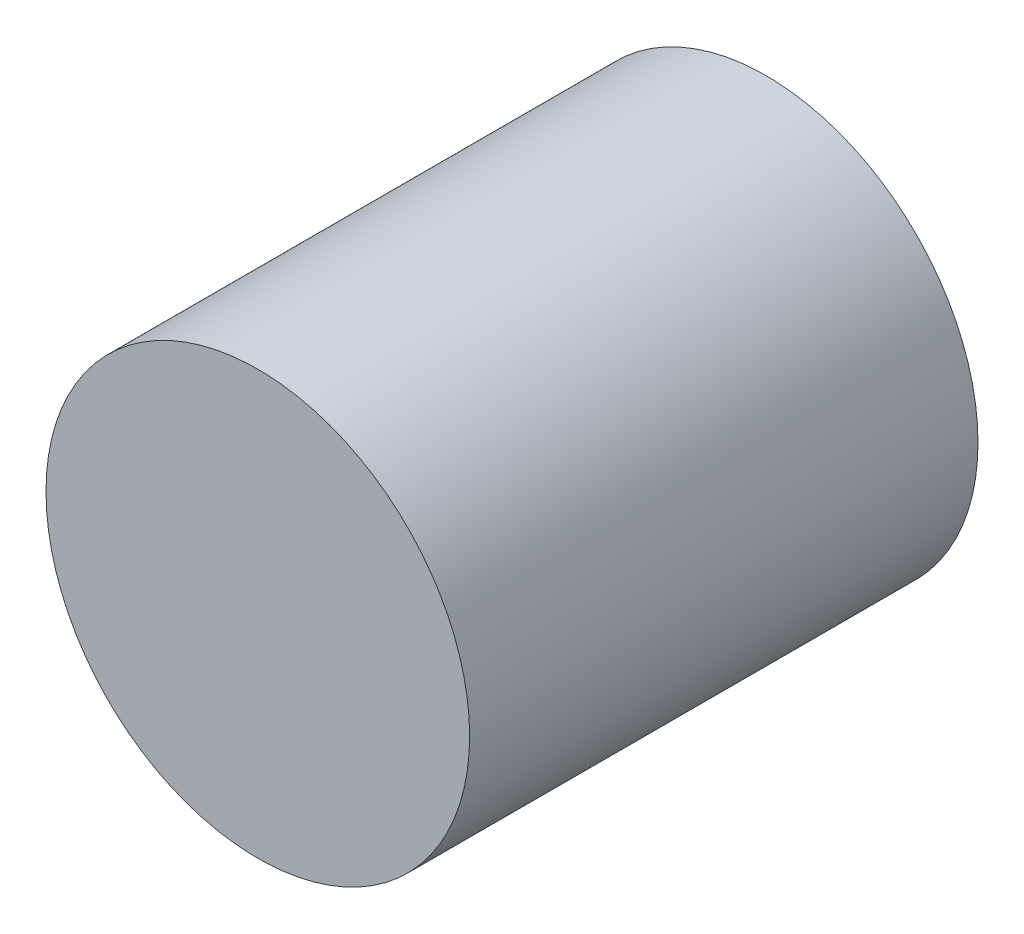
ISO-10303-21;
HEADER;
FILE_DESCRIPTION(('STEP AP214'),'2;1');
FILE_NAME('part.step','',(''),(''),'','','');
FILE_SCHEMA(('AUTOMOTIVE_DESIGN { 1 0 10303 214 1 1 1 1 }'));
ENDSEC;
DATA;
#1=APPLICATION_CONTEXT('core data for automotive mechanical design processes');
#2=APPLICATION_PROTOCOL_DEFINITION('international standard','automotive_design',2000,#1);
#3=PRODUCT_CONTEXT('',#1,'mechanical');
#4=PRODUCT('Part','Part','',(#3));
#5=PRODUCT_RELATED_PRODUCT_CATEGORY('part','',(#4));
#6=PRODUCT_DEFINITION_FORMATION('','',#4);
#7=PRODUCT_DEFINITION_CONTEXT('part definition',#1,'design');
#8=PRODUCT_DEFINITION('design','',#6,#7);
#9=PRODUCT_DEFINITION_SHAPE('','',#8);
#10=(LENGTH_UNIT() NAMED_UNIT(*) SI_UNIT(.MILLI.,.METRE.));
#11=(NAMED_UNIT(*) PLANE_ANGLE_UNIT() SI_UNIT($,.RADIAN.));
#12=(NAMED_UNIT(*) SI_UNIT($,.STERADIAN.) SOLID_ANGLE_UNIT());
#13=UNCERTAINTY_MEASURE_WITH_UNIT(LENGTH_MEASURE(1.E-05),#10,'distance_accuracy_value','');
#14=(GEOMETRIC_REPRESENTATION_CONTEXT(3) GLOBAL_UNCERTAINTY_ASSIGNED_CONTEXT((#13)) GLOBAL_UNIT_ASSIGNED_CONTEXT((#10,
#11,#12)) REPRESENTATION_CONTEXT('',''));
#15=CARTESIAN_POINT('',(0.,0.,0.));
#16=DIRECTION('',(0.,0.,1.));
#17=DIRECTION('',(1.,0.,0.));
#18=AXIS2_PLACEMENT_3D('',#15,#16,#17);
#19=CARTESIAN_POINT('',(0.,0.,60.));
#20=DIRECTION('',(0.,0.,-1.));
#21=DIRECTION('',(-1.,0.,0.));
#22=AXIS2_PLACEMENT_3D('',#19,#20,#21);
#23=CYLINDRICAL_SURFACE('',#22,25.);
#24=CARTESIAN_POINT('',(0.,0.,60.));
#25=DIRECTION('',(0.,0.,1.));
#26=DIRECTION('',(1.,0.,0.));
#27=AXIS2_PLACEMENT_3D('',#24,#25,#26);
#28=CIRCLE('',#27,25.);
#29=CARTESIAN_POINT('',(25.,0.,60.));
#30=VERTEX_POINT('',#29);
#31=EDGE_CURVE('E10',#30,#30,#28,.T.);
#32=ORIENTED_EDGE('',*,*,#31,.F.);
#33=EDGE_LOOP('',(#32));
#34=FACE_BOUND('',#33,.T.);
#35=CARTESIAN_POINT('',(0.,0.,0.));
#36=DIRECTION('',(0.,0.,1.));
#37=DIRECTION('',(1.,0.,0.));
#38=AXIS2_PLACEMENT_3D('',#35,#36,#37);
#39=CIRCLE('',#38,25.);
#40=CARTESIAN_POINT('',(25.,0.,0.));
#41=VERTEX_POINT('',#40);
#42=EDGE_CURVE('E38',#41,#41,#39,.T.);
#43=ORIENTED_EDGE('',*,*,#42,.T.);
#44=EDGE_LOOP('',(#43));
#45=FACE_BOUND('',#44,.T.);
#46=ADVANCED_FACE('F35',(#34,#45),#23,.T.);
#47=CARTESIAN_POINT('',(0.,0.,60.));
#48=DIRECTION('',(0.,0.,1.));
#49=DIRECTION('',(1.,0.,0.));
#50=AXIS2_PLACEMENT_3D('',#47,#48,#49);
#51=PLANE('',#50);
#52=ORIENTED_EDGE('',*,*,#31,.T.);
#53=EDGE_LOOP('',(#52));
#54=FACE_BOUND('',#53,.T.);
#55=ADVANCED_FACE('F50',(#54),#51,.T.);
#56=CARTESIAN_POINT('',(0.,0.,0.));
#57=DIRECTION('',(0.,0.,1.));
#58=DIRECTION('',(1.,0.,0.));
#59=AXIS2_PLACEMENT_3D('',#56,#57,#58);
#60=PLANE('',#59);
#61=ORIENTED_EDGE('',*,*,#42,.F.);
#62=EDGE_LOOP('',(#61));
#63=FACE_BOUND('',#62,.T.);
#64=ADVANCED_FACE('F48',(#63),#60,.F.);
#65=CLOSED_SHELL('',(#46,#55,#64));
#66=MANIFOLD_SOLID_BREP('B2',#65);
#67=ADVANCED_BREP_SHAPE_REPRESENTATION('',(#18,#66),#14);
#68=SHAPE_DEFINITION_REPRESENTATION(#9,#67);
ENDSEC;
END-ISO-10303-21;
